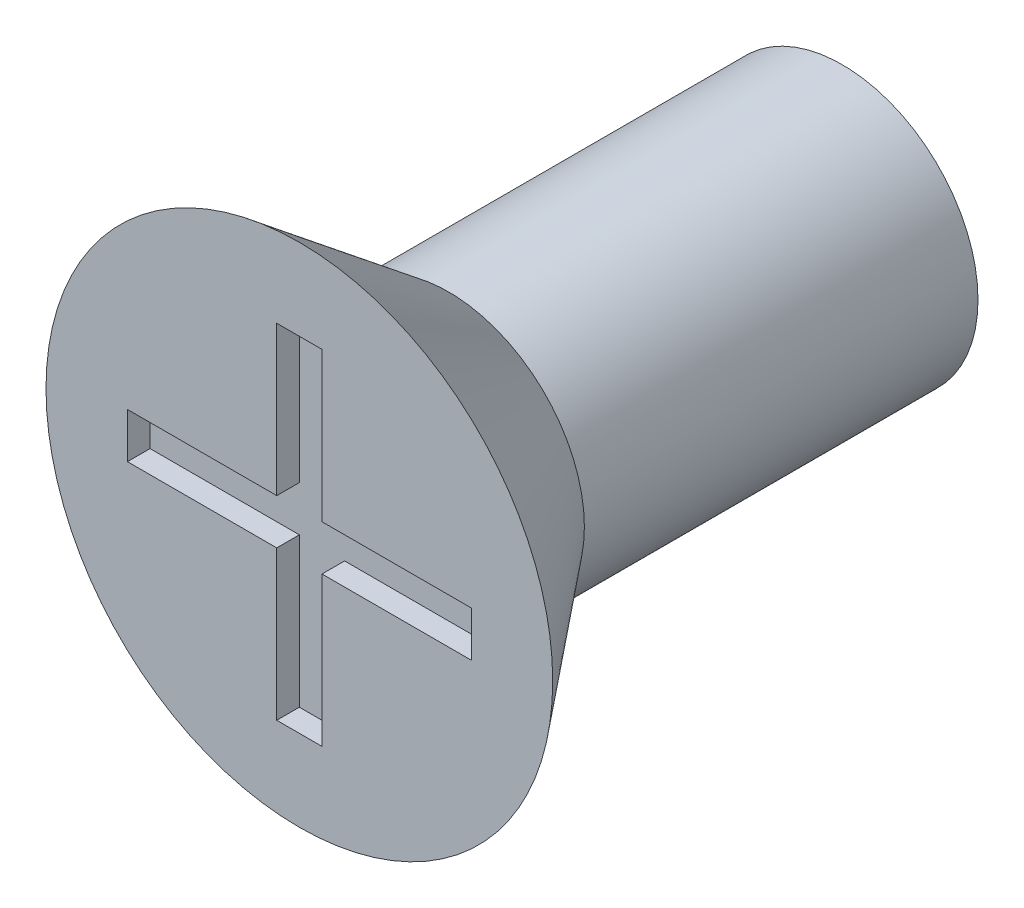
ISO-10303-21;
HEADER;
FILE_DESCRIPTION(('STEP AP214'),'2;1');
FILE_NAME('part.step','',(''),(''),'','','');
FILE_SCHEMA(('AUTOMOTIVE_DESIGN { 1 0 10303 214 1 1 1 1 }'));
ENDSEC;
DATA;
#1=APPLICATION_CONTEXT('core data for automotive mechanical design processes');
#2=APPLICATION_PROTOCOL_DEFINITION('international standard','automotive_design',2000,#1);
#3=PRODUCT_CONTEXT('',#1,'mechanical');
#4=PRODUCT('Part','Part','',(#3));
#5=PRODUCT_RELATED_PRODUCT_CATEGORY('part','',(#4));
#6=PRODUCT_DEFINITION_FORMATION('','',#4);
#7=PRODUCT_DEFINITION_CONTEXT('part definition',#1,'design');
#8=PRODUCT_DEFINITION('design','',#6,#7);
#9=PRODUCT_DEFINITION_SHAPE('','',#8);
#10=(LENGTH_UNIT() NAMED_UNIT(*) SI_UNIT(.MILLI.,.METRE.));
#11=(NAMED_UNIT(*) PLANE_ANGLE_UNIT() SI_UNIT($,.RADIAN.));
#12=(NAMED_UNIT(*) SI_UNIT($,.STERADIAN.) SOLID_ANGLE_UNIT());
#13=UNCERTAINTY_MEASURE_WITH_UNIT(LENGTH_MEASURE(1.E-05),#10,'distance_accuracy_value','');
#14=(GEOMETRIC_REPRESENTATION_CONTEXT(3) GLOBAL_UNCERTAINTY_ASSIGNED_CONTEXT((#13)) GLOBAL_UNIT_ASSIGNED_CONTEXT((#10,
#11,#12)) REPRESENTATION_CONTEXT('',''));
#15=CARTESIAN_POINT('',(0.,0.,0.));
#16=DIRECTION('',(0.,0.,1.));
#17=DIRECTION('',(1.,0.,0.));
#18=AXIS2_PLACEMENT_3D('',#15,#16,#17);
#19=CARTESIAN_POINT('',(0.,0.,0.));
#20=DIRECTION('',(0.,0.,-1.));
#21=DIRECTION('',(-1.,0.,0.));
#22=AXIS2_PLACEMENT_3D('',#19,#20,#21);
#23=PLANE('',#22);
#24=CARTESIAN_POINT('',(0.,0.,0.));
#25=DIRECTION('',(0.,0.,1.));
#26=DIRECTION('',(1.,0.,0.));
#27=AXIS2_PLACEMENT_3D('',#24,#25,#26);
#28=CIRCLE('',#27,2.8);
#29=CARTESIAN_POINT('',(2.8,0.,0.));
#30=VERTEX_POINT('',#29);
#31=EDGE_CURVE('E188',#30,#30,#28,.T.);
#32=ORIENTED_EDGE('',*,*,#31,.T.);
#33=EDGE_LOOP('',(#32));
#34=FACE_BOUND('',#33,.T.);
#35=DIRECTION('',(1.,0.,0.));
#36=VECTOR('',#35,1.);
#37=CARTESIAN_POINT('',(0.,1.9,0.));
#38=LINE('',#37,#36);
#39=CARTESIAN_POINT('',(-0.25,1.9,0.));
#40=VERTEX_POINT('',#39);
#41=CARTESIAN_POINT('',(0.25,1.9,0.));
#42=VERTEX_POINT('',#41);
#43=EDGE_CURVE('E47',#40,#42,#38,.T.);
#44=ORIENTED_EDGE('',*,*,#43,.T.);
#45=DIRECTION('',(0.,-1.,0.));
#46=VECTOR('',#45,1.);
#47=CARTESIAN_POINT('',(0.25,-6.30142135623731,0.));
#48=LINE('',#47,#46);
#49=CARTESIAN_POINT('',(0.25,0.25,0.));
#50=VERTEX_POINT('',#49);
#51=EDGE_CURVE('E97',#42,#50,#48,.T.);
#52=ORIENTED_EDGE('',*,*,#51,.T.);
#53=DIRECTION('',(1.,0.,0.));
#54=VECTOR('',#53,1.);
#55=CARTESIAN_POINT('',(0.,0.25,0.));
#56=LINE('',#55,#54);
#57=CARTESIAN_POINT('',(1.9,0.25,0.));
#58=VERTEX_POINT('',#57);
#59=EDGE_CURVE('E182',#50,#58,#56,.T.);
#60=ORIENTED_EDGE('',*,*,#59,.T.);
#61=DIRECTION('',(0.,-1.,0.));
#62=VECTOR('',#61,1.);
#63=CARTESIAN_POINT('',(1.9,-6.30142135623731,0.));
#64=LINE('',#63,#62);
#65=CARTESIAN_POINT('',(1.9,-0.25,0.));
#66=VERTEX_POINT('',#65);
#67=EDGE_CURVE('E141',#58,#66,#64,.T.);
#68=ORIENTED_EDGE('',*,*,#67,.T.);
#69=DIRECTION('',(1.,0.,0.));
#70=VECTOR('',#69,1.);
#71=CARTESIAN_POINT('',(0.,-0.25,0.));
#72=LINE('',#71,#70);
#73=CARTESIAN_POINT('',(0.25,-0.25,0.));
#74=VERTEX_POINT('',#73);
#75=EDGE_CURVE('E178',#74,#66,#72,.T.);
#76=ORIENTED_EDGE('',*,*,#75,.F.);
#77=DIRECTION('',(0.,-1.,0.));
#78=VECTOR('',#77,1.);
#79=CARTESIAN_POINT('',(0.25,-6.30142135623731,0.));
#80=LINE('',#79,#78);
#81=CARTESIAN_POINT('',(0.25,-1.9,0.));
#82=VERTEX_POINT('',#81);
#83=EDGE_CURVE('E175',#74,#82,#80,.T.);
#84=ORIENTED_EDGE('',*,*,#83,.T.);
#85=DIRECTION('',(-1.,0.,0.));
#86=VECTOR('',#85,1.);
#87=CARTESIAN_POINT('',(0.,-1.9,0.));
#88=LINE('',#87,#86);
#89=CARTESIAN_POINT('',(-0.25,-1.9,0.));
#90=VERTEX_POINT('',#89);
#91=EDGE_CURVE('E172',#82,#90,#88,.T.);
#92=ORIENTED_EDGE('',*,*,#91,.T.);
#93=DIRECTION('',(0.,-1.,0.));
#94=VECTOR('',#93,1.);
#95=CARTESIAN_POINT('',(-0.25,-6.30142135623731,0.));
#96=LINE('',#95,#94);
#97=CARTESIAN_POINT('',(-0.25,-0.25,0.));
#98=VERTEX_POINT('',#97);
#99=EDGE_CURVE('E169',#98,#90,#96,.T.);
#100=ORIENTED_EDGE('',*,*,#99,.F.);
#101=DIRECTION('',(1.,0.,0.));
#102=VECTOR('',#101,1.);
#103=CARTESIAN_POINT('',(0.,-0.25,0.));
#104=LINE('',#103,#102);
#105=CARTESIAN_POINT('',(-1.9,-0.25,0.));
#106=VERTEX_POINT('',#105);
#107=EDGE_CURVE('E166',#106,#98,#104,.T.);
#108=ORIENTED_EDGE('',*,*,#107,.F.);
#109=DIRECTION('',(0.,-1.,0.));
#110=VECTOR('',#109,1.);
#111=CARTESIAN_POINT('',(-1.9,-6.30142135623731,0.));
#112=LINE('',#111,#110);
#113=CARTESIAN_POINT('',(-1.9,0.25,0.));
#114=VERTEX_POINT('',#113);
#115=EDGE_CURVE('E163',#114,#106,#112,.T.);
#116=ORIENTED_EDGE('',*,*,#115,.F.);
#117=DIRECTION('',(1.,0.,0.));
#118=VECTOR('',#117,1.);
#119=CARTESIAN_POINT('',(0.,0.25,0.));
#120=LINE('',#119,#118);
#121=CARTESIAN_POINT('',(-0.25,0.25,0.));
#122=VERTEX_POINT('',#121);
#123=EDGE_CURVE('E160',#114,#122,#120,.T.);
#124=ORIENTED_EDGE('',*,*,#123,.T.);
#125=DIRECTION('',(0.,-1.,0.));
#126=VECTOR('',#125,1.);
#127=CARTESIAN_POINT('',(-0.25,-6.30142135623731,0.));
#128=LINE('',#127,#126);
#129=EDGE_CURVE('E157',#40,#122,#128,.T.);
#130=ORIENTED_EDGE('',*,*,#129,.F.);
#131=EDGE_LOOP('',(#44,#52,#60,#68,#76,#84,#92,#100,#108,#116,#124,#130));
#132=FACE_BOUND('',#131,.T.);
#133=ADVANCED_FACE('F32',(#34,#132),#23,.F.);
#134=CARTESIAN_POINT('',(0.,0.,-6.));
#135=DIRECTION('',(0.,0.,1.));
#136=DIRECTION('',(1.,0.,0.));
#137=AXIS2_PLACEMENT_3D('',#134,#135,#136);
#138=PLANE('',#137);
#139=CARTESIAN_POINT('',(0.,0.,-6.));
#140=DIRECTION('',(0.,0.,1.));
#141=DIRECTION('',(1.,0.,0.));
#142=AXIS2_PLACEMENT_3D('',#139,#140,#141);
#143=CIRCLE('',#142,1.5);
#144=CARTESIAN_POINT('',(1.5,0.,-6.));
#145=VERTEX_POINT('',#144);
#146=EDGE_CURVE('E11',#145,#145,#143,.T.);
#147=ORIENTED_EDGE('',*,*,#146,.F.);
#148=EDGE_LOOP('',(#147));
#149=FACE_BOUND('',#148,.T.);
#150=ADVANCED_FACE('F34',(#149),#138,.F.);
#151=CARTESIAN_POINT('',(0.,0.,0.));
#152=DIRECTION('',(0.,0.,1.));
#153=DIRECTION('',(1.,0.,0.));
#154=AXIS2_PLACEMENT_3D('',#151,#152,#153);
#155=CYLINDRICAL_SURFACE('',#154,1.5);
#156=CARTESIAN_POINT('',(0.,0.,-1.65));
#157=DIRECTION('',(0.,0.,1.));
#158=DIRECTION('',(1.,0.,0.));
#159=AXIS2_PLACEMENT_3D('',#156,#157,#158);
#160=CIRCLE('',#159,1.5);
#161=CARTESIAN_POINT('',(1.5,0.,-1.65));
#162=VERTEX_POINT('',#161);
#163=EDGE_CURVE('E40',#162,#162,#160,.T.);
#164=ORIENTED_EDGE('',*,*,#163,.F.);
#165=EDGE_LOOP('',(#164));
#166=FACE_BOUND('',#165,.T.);
#167=ORIENTED_EDGE('',*,*,#146,.T.);
#168=EDGE_LOOP('',(#167));
#169=FACE_BOUND('',#168,.T.);
#170=ADVANCED_FACE('F212',(#166,#169),#155,.T.);
#171=CARTESIAN_POINT('',(0.,0.,-1.65));
#172=DIRECTION('',(0.,0.,1.));
#173=DIRECTION('',(1.,0.,0.));
#174=AXIS2_PLACEMENT_3D('',#171,#172,#173);
#175=CONICAL_SURFACE('',#174,1.5,0.667306134978354);
#176=ORIENTED_EDGE('',*,*,#31,.F.);
#177=EDGE_LOOP('',(#176));
#178=FACE_BOUND('',#177,.T.);
#179=ORIENTED_EDGE('',*,*,#163,.T.);
#180=EDGE_LOOP('',(#179));
#181=FACE_BOUND('',#180,.T.);
#182=ADVANCED_FACE('F210',(#178,#181),#175,.T.);
#183=CARTESIAN_POINT('',(0.,1.9,-0.25));
#184=DIRECTION('',(0.,-1.,0.));
#185=DIRECTION('',(0.,0.,-1.));
#186=AXIS2_PLACEMENT_3D('',#183,#184,#185);
#187=PLANE('',#186);
#188=ORIENTED_EDGE('',*,*,#43,.F.);
#189=DIRECTION('',(0.,0.,1.));
#190=VECTOR('',#189,1.);
#191=CARTESIAN_POINT('',(-0.25,1.9,-0.25));
#192=LINE('',#191,#190);
#193=CARTESIAN_POINT('',(-0.25,1.9,-0.25));
#194=VERTEX_POINT('',#193);
#195=EDGE_CURVE('E100',#194,#40,#192,.T.);
#196=ORIENTED_EDGE('',*,*,#195,.F.);
#197=DIRECTION('',(1.,0.,0.));
#198=VECTOR('',#197,1.);
#199=CARTESIAN_POINT('',(0.,1.9,-0.25));
#200=LINE('',#199,#198);
#201=CARTESIAN_POINT('',(0.25,1.9,-0.25));
#202=VERTEX_POINT('',#201);
#203=EDGE_CURVE('E185',#194,#202,#200,.T.);
#204=ORIENTED_EDGE('',*,*,#203,.T.);
#205=DIRECTION('',(0.,0.,1.));
#206=VECTOR('',#205,1.);
#207=CARTESIAN_POINT('',(0.25,1.9,-0.25));
#208=LINE('',#207,#206);
#209=EDGE_CURVE('E186',#202,#42,#208,.T.);
#210=ORIENTED_EDGE('',*,*,#209,.T.);
#211=EDGE_LOOP('',(#188,#196,#204,#210));
#212=FACE_BOUND('',#211,.T.);
#213=ADVANCED_FACE('F228',(#212),#187,.T.);
#214=CARTESIAN_POINT('',(0.25,-6.30142135623731,-0.25));
#215=DIRECTION('',(-1.,0.,0.));
#216=DIRECTION('',(0.,0.,1.));
#217=AXIS2_PLACEMENT_3D('',#214,#215,#216);
#218=PLANE('',#217);
#219=ORIENTED_EDGE('',*,*,#51,.F.);
#220=ORIENTED_EDGE('',*,*,#209,.F.);
#221=DIRECTION('',(0.,-1.,0.));
#222=VECTOR('',#221,1.);
#223=CARTESIAN_POINT('',(0.25,-6.30142135623731,-0.25));
#224=LINE('',#223,#222);
#225=CARTESIAN_POINT('',(0.25,0.25,-0.25));
#226=VERTEX_POINT('',#225);
#227=EDGE_CURVE('E56',#202,#226,#224,.T.);
#228=ORIENTED_EDGE('',*,*,#227,.T.);
#229=DIRECTION('',(0.,0.,1.));
#230=VECTOR('',#229,1.);
#231=CARTESIAN_POINT('',(0.25,0.25,-0.25));
#232=LINE('',#231,#230);
#233=EDGE_CURVE('E133',#226,#50,#232,.T.);
#234=ORIENTED_EDGE('',*,*,#233,.T.);
#235=EDGE_LOOP('',(#219,#220,#228,#234));
#236=FACE_BOUND('',#235,.T.);
#237=ADVANCED_FACE('F235',(#236),#218,.T.);
#238=CARTESIAN_POINT('',(0.,0.25,-0.25));
#239=DIRECTION('',(0.,-1.,0.));
#240=DIRECTION('',(0.,0.,-1.));
#241=AXIS2_PLACEMENT_3D('',#238,#239,#240);
#242=PLANE('',#241);
#243=ORIENTED_EDGE('',*,*,#59,.F.);
#244=ORIENTED_EDGE('',*,*,#233,.F.);
#245=DIRECTION('',(1.,0.,0.));
#246=VECTOR('',#245,1.);
#247=CARTESIAN_POINT('',(0.,0.25,-0.25));
#248=LINE('',#247,#246);
#249=CARTESIAN_POINT('',(1.9,0.25,-0.25));
#250=VERTEX_POINT('',#249);
#251=EDGE_CURVE('E127',#226,#250,#248,.T.);
#252=ORIENTED_EDGE('',*,*,#251,.T.);
#253=DIRECTION('',(0.,0.,1.));
#254=VECTOR('',#253,1.);
#255=CARTESIAN_POINT('',(1.9,0.25,-0.25));
#256=LINE('',#255,#254);
#257=EDGE_CURVE('E131',#250,#58,#256,.T.);
#258=ORIENTED_EDGE('',*,*,#257,.T.);
#259=EDGE_LOOP('',(#243,#244,#252,#258));
#260=FACE_BOUND('',#259,.T.);
#261=ADVANCED_FACE('F130',(#260),#242,.T.);
#262=CARTESIAN_POINT('',(1.9,-6.30142135623731,-0.25));
#263=DIRECTION('',(-1.,0.,0.));
#264=DIRECTION('',(0.,0.,1.));
#265=AXIS2_PLACEMENT_3D('',#262,#263,#264);
#266=PLANE('',#265);
#267=ORIENTED_EDGE('',*,*,#67,.F.);
#268=ORIENTED_EDGE('',*,*,#257,.F.);
#269=DIRECTION('',(0.,-1.,0.));
#270=VECTOR('',#269,1.);
#271=CARTESIAN_POINT('',(1.9,-6.30142135623731,-0.25));
#272=LINE('',#271,#270);
#273=CARTESIAN_POINT('',(1.9,-0.25,-0.25));
#274=VERTEX_POINT('',#273);
#275=EDGE_CURVE('E135',#250,#274,#272,.T.);
#276=ORIENTED_EDGE('',*,*,#275,.T.);
#277=DIRECTION('',(0.,0.,1.));
#278=VECTOR('',#277,1.);
#279=CARTESIAN_POINT('',(1.9,-0.25,-0.25));
#280=LINE('',#279,#278);
#281=EDGE_CURVE('E143',#274,#66,#280,.T.);
#282=ORIENTED_EDGE('',*,*,#281,.T.);
#283=EDGE_LOOP('',(#267,#268,#276,#282));
#284=FACE_BOUND('',#283,.T.);
#285=ADVANCED_FACE('F138',(#284),#266,.T.);
#286=CARTESIAN_POINT('',(0.,-0.25,-0.25));
#287=DIRECTION('',(0.,-1.,0.));
#288=DIRECTION('',(0.,0.,-1.));
#289=AXIS2_PLACEMENT_3D('',#286,#287,#288);
#290=PLANE('',#289);
#291=ORIENTED_EDGE('',*,*,#75,.T.);
#292=ORIENTED_EDGE('',*,*,#281,.F.);
#293=DIRECTION('',(1.,0.,0.));
#294=VECTOR('',#293,1.);
#295=CARTESIAN_POINT('',(0.,-0.25,-0.25));
#296=LINE('',#295,#294);
#297=CARTESIAN_POINT('',(0.25,-0.25,-0.25));
#298=VERTEX_POINT('',#297);
#299=EDGE_CURVE('E149',#298,#274,#296,.T.);
#300=ORIENTED_EDGE('',*,*,#299,.F.);
#301=DIRECTION('',(0.,0.,1.));
#302=VECTOR('',#301,1.);
#303=CARTESIAN_POINT('',(0.25,-0.25,-0.25));
#304=LINE('',#303,#302);
#305=EDGE_CURVE('E191',#298,#74,#304,.T.);
#306=ORIENTED_EDGE('',*,*,#305,.T.);
#307=EDGE_LOOP('',(#291,#292,#300,#306));
#308=FACE_BOUND('',#307,.T.);
#309=ADVANCED_FACE('F249',(#308),#290,.F.);
#310=CARTESIAN_POINT('',(0.25,-6.30142135623731,-0.25));
#311=DIRECTION('',(-1.,0.,0.));
#312=DIRECTION('',(0.,0.,1.));
#313=AXIS2_PLACEMENT_3D('',#310,#311,#312);
#314=PLANE('',#313);
#315=ORIENTED_EDGE('',*,*,#83,.F.);
#316=ORIENTED_EDGE('',*,*,#305,.F.);
#317=DIRECTION('',(0.,-1.,0.));
#318=VECTOR('',#317,1.);
#319=CARTESIAN_POINT('',(0.25,-6.30142135623731,-0.25));
#320=LINE('',#319,#318);
#321=CARTESIAN_POINT('',(0.25,-1.9,-0.25));
#322=VERTEX_POINT('',#321);
#323=EDGE_CURVE('E151',#298,#322,#320,.T.);
#324=ORIENTED_EDGE('',*,*,#323,.T.);
#325=DIRECTION('',(0.,0.,1.));
#326=VECTOR('',#325,1.);
#327=CARTESIAN_POINT('',(0.25,-1.9,-0.25));
#328=LINE('',#327,#326);
#329=EDGE_CURVE('E193',#322,#82,#328,.T.);
#330=ORIENTED_EDGE('',*,*,#329,.T.);
#331=EDGE_LOOP('',(#315,#316,#324,#330));
#332=FACE_BOUND('',#331,.T.);
#333=ADVANCED_FACE('F252',(#332),#314,.T.);
#334=CARTESIAN_POINT('',(0.,-1.9,-0.25));
#335=DIRECTION('',(0.,1.,0.));
#336=DIRECTION('',(0.,0.,1.));
#337=AXIS2_PLACEMENT_3D('',#334,#335,#336);
#338=PLANE('',#337);
#339=ORIENTED_EDGE('',*,*,#91,.F.);
#340=ORIENTED_EDGE('',*,*,#329,.F.);
#341=DIRECTION('',(-1.,0.,0.));
#342=VECTOR('',#341,1.);
#343=CARTESIAN_POINT('',(0.,-1.9,-0.25));
#344=LINE('',#343,#342);
#345=CARTESIAN_POINT('',(-0.25,-1.9,-0.25));
#346=VERTEX_POINT('',#345);
#347=EDGE_CURVE('E306',#322,#346,#344,.T.);
#348=ORIENTED_EDGE('',*,*,#347,.T.);
#349=DIRECTION('',(0.,0.,1.));
#350=VECTOR('',#349,1.);
#351=CARTESIAN_POINT('',(-0.25,-1.9,-0.25));
#352=LINE('',#351,#350);
#353=EDGE_CURVE('E195',#346,#90,#352,.T.);
#354=ORIENTED_EDGE('',*,*,#353,.T.);
#355=EDGE_LOOP('',(#339,#340,#348,#354));
#356=FACE_BOUND('',#355,.T.);
#357=ADVANCED_FACE('F256',(#356),#338,.T.);
#358=CARTESIAN_POINT('',(-0.25,-6.30142135623731,-0.25));
#359=DIRECTION('',(-1.,0.,0.));
#360=DIRECTION('',(0.,0.,1.));
#361=AXIS2_PLACEMENT_3D('',#358,#359,#360);
#362=PLANE('',#361);
#363=ORIENTED_EDGE('',*,*,#99,.T.);
#364=ORIENTED_EDGE('',*,*,#353,.F.);
#365=DIRECTION('',(0.,-1.,0.));
#366=VECTOR('',#365,1.);
#367=CARTESIAN_POINT('',(-0.25,-6.30142135623731,-0.25));
#368=LINE('',#367,#366);
#369=CARTESIAN_POINT('',(-0.25,-0.25,-0.25));
#370=VERTEX_POINT('',#369);
#371=EDGE_CURVE('E303',#370,#346,#368,.T.);
#372=ORIENTED_EDGE('',*,*,#371,.F.);
#373=DIRECTION('',(0.,0.,1.));
#374=VECTOR('',#373,1.);
#375=CARTESIAN_POINT('',(-0.25,-0.25,-0.25));
#376=LINE('',#375,#374);
#377=EDGE_CURVE('E197',#370,#98,#376,.T.);
#378=ORIENTED_EDGE('',*,*,#377,.T.);
#379=EDGE_LOOP('',(#363,#364,#372,#378));
#380=FACE_BOUND('',#379,.T.);
#381=ADVANCED_FACE('F260',(#380),#362,.F.);
#382=CARTESIAN_POINT('',(0.,-0.25,-0.25));
#383=DIRECTION('',(0.,-1.,0.));
#384=DIRECTION('',(0.,0.,-1.));
#385=AXIS2_PLACEMENT_3D('',#382,#383,#384);
#386=PLANE('',#385);
#387=ORIENTED_EDGE('',*,*,#107,.T.);
#388=ORIENTED_EDGE('',*,*,#377,.F.);
#389=DIRECTION('',(1.,0.,0.));
#390=VECTOR('',#389,1.);
#391=CARTESIAN_POINT('',(0.,-0.25,-0.25));
#392=LINE('',#391,#390);
#393=CARTESIAN_POINT('',(-1.9,-0.25,-0.25));
#394=VERTEX_POINT('',#393);
#395=EDGE_CURVE('E296',#394,#370,#392,.T.);
#396=ORIENTED_EDGE('',*,*,#395,.F.);
#397=DIRECTION('',(0.,0.,1.));
#398=VECTOR('',#397,1.);
#399=CARTESIAN_POINT('',(-1.9,-0.25,-0.25));
#400=LINE('',#399,#398);
#401=EDGE_CURVE('E199',#394,#106,#400,.T.);
#402=ORIENTED_EDGE('',*,*,#401,.T.);
#403=EDGE_LOOP('',(#387,#388,#396,#402));
#404=FACE_BOUND('',#403,.T.);
#405=ADVANCED_FACE('F264',(#404),#386,.F.);
#406=CARTESIAN_POINT('',(-1.9,-6.30142135623731,-0.25));
#407=DIRECTION('',(-1.,0.,0.));
#408=DIRECTION('',(0.,0.,1.));
#409=AXIS2_PLACEMENT_3D('',#406,#407,#408);
#410=PLANE('',#409);
#411=ORIENTED_EDGE('',*,*,#115,.T.);
#412=ORIENTED_EDGE('',*,*,#401,.F.);
#413=DIRECTION('',(0.,-1.,0.));
#414=VECTOR('',#413,1.);
#415=CARTESIAN_POINT('',(-1.9,-6.30142135623731,-0.25));
#416=LINE('',#415,#414);
#417=CARTESIAN_POINT('',(-1.9,0.25,-0.25));
#418=VERTEX_POINT('',#417);
#419=EDGE_CURVE('E293',#418,#394,#416,.T.);
#420=ORIENTED_EDGE('',*,*,#419,.F.);
#421=DIRECTION('',(0.,0.,1.));
#422=VECTOR('',#421,1.);
#423=CARTESIAN_POINT('',(-1.9,0.25,-0.25));
#424=LINE('',#423,#422);
#425=EDGE_CURVE('E201',#418,#114,#424,.T.);
#426=ORIENTED_EDGE('',*,*,#425,.T.);
#427=EDGE_LOOP('',(#411,#412,#420,#426));
#428=FACE_BOUND('',#427,.T.);
#429=ADVANCED_FACE('F268',(#428),#410,.F.);
#430=CARTESIAN_POINT('',(0.,0.25,-0.25));
#431=DIRECTION('',(0.,-1.,0.));
#432=DIRECTION('',(0.,0.,-1.));
#433=AXIS2_PLACEMENT_3D('',#430,#431,#432);
#434=PLANE('',#433);
#435=ORIENTED_EDGE('',*,*,#123,.F.);
#436=ORIENTED_EDGE('',*,*,#425,.F.);
#437=DIRECTION('',(1.,0.,0.));
#438=VECTOR('',#437,1.);
#439=CARTESIAN_POINT('',(0.,0.25,-0.25));
#440=LINE('',#439,#438);
#441=CARTESIAN_POINT('',(-0.25,0.25,-0.25));
#442=VERTEX_POINT('',#441);
#443=EDGE_CURVE('E290',#418,#442,#440,.T.);
#444=ORIENTED_EDGE('',*,*,#443,.T.);
#445=DIRECTION('',(0.,0.,1.));
#446=VECTOR('',#445,1.);
#447=CARTESIAN_POINT('',(-0.25,0.25,-0.25));
#448=LINE('',#447,#446);
#449=EDGE_CURVE('E203',#442,#122,#448,.T.);
#450=ORIENTED_EDGE('',*,*,#449,.T.);
#451=EDGE_LOOP('',(#435,#436,#444,#450));
#452=FACE_BOUND('',#451,.T.);
#453=ADVANCED_FACE('F272',(#452),#434,.T.);
#454=CARTESIAN_POINT('',(-0.25,-6.30142135623731,-0.25));
#455=DIRECTION('',(-1.,0.,0.));
#456=DIRECTION('',(0.,0.,1.));
#457=AXIS2_PLACEMENT_3D('',#454,#455,#456);
#458=PLANE('',#457);
#459=ORIENTED_EDGE('',*,*,#129,.T.);
#460=ORIENTED_EDGE('',*,*,#449,.F.);
#461=DIRECTION('',(0.,-1.,0.));
#462=VECTOR('',#461,1.);
#463=CARTESIAN_POINT('',(-0.25,-6.30142135623731,-0.25));
#464=LINE('',#463,#462);
#465=EDGE_CURVE('E294',#194,#442,#464,.T.);
#466=ORIENTED_EDGE('',*,*,#465,.F.);
#467=ORIENTED_EDGE('',*,*,#195,.T.);
#468=EDGE_LOOP('',(#459,#460,#466,#467));
#469=FACE_BOUND('',#468,.T.);
#470=ADVANCED_FACE('F275',(#469),#458,.F.);
#471=CARTESIAN_POINT('',(0.,-6.30142135623731,-0.25));
#472=DIRECTION('',(0.,0.,1.));
#473=DIRECTION('',(1.,0.,0.));
#474=AXIS2_PLACEMENT_3D('',#471,#472,#473);
#475=PLANE('',#474);
#476=ORIENTED_EDGE('',*,*,#203,.F.);
#477=ORIENTED_EDGE('',*,*,#465,.T.);
#478=ORIENTED_EDGE('',*,*,#443,.F.);
#479=ORIENTED_EDGE('',*,*,#419,.T.);
#480=ORIENTED_EDGE('',*,*,#395,.T.);
#481=ORIENTED_EDGE('',*,*,#371,.T.);
#482=ORIENTED_EDGE('',*,*,#347,.F.);
#483=ORIENTED_EDGE('',*,*,#323,.F.);
#484=ORIENTED_EDGE('',*,*,#299,.T.);
#485=ORIENTED_EDGE('',*,*,#275,.F.);
#486=ORIENTED_EDGE('',*,*,#251,.F.);
#487=ORIENTED_EDGE('',*,*,#227,.F.);
#488=EDGE_LOOP('',(#476,#477,#478,#479,#480,#481,#482,#483,#484,#485,#486,#487));
#489=FACE_BOUND('',#488,.T.);
#490=ADVANCED_FACE('F146',(#489),#475,.T.);
#491=CLOSED_SHELL('',(#133,#150,#170,#182,#213,#237,#261,#285,#309,#333,#357,#381,#405,#429,
#453,#470,#490));
#492=MANIFOLD_SOLID_BREP('B2',#491);
#493=ADVANCED_BREP_SHAPE_REPRESENTATION('',(#18,#492),#14);
#494=SHAPE_DEFINITION_REPRESENTATION(#9,#493);
ENDSEC;
END-ISO-10303-21;
